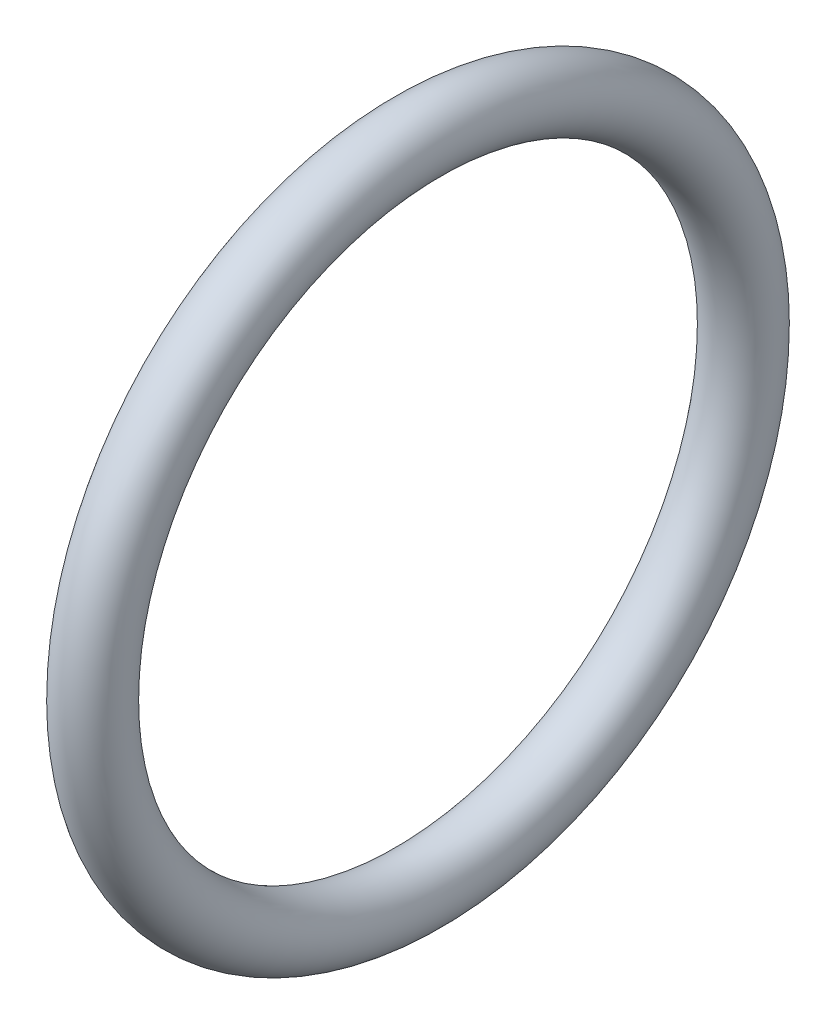
ISO-10303-21;
HEADER;
FILE_DESCRIPTION(('STEP AP214'),'2;1');
FILE_NAME('part.step','',(''),(''),'','','');
FILE_SCHEMA(('AUTOMOTIVE_DESIGN { 1 0 10303 214 1 1 1 1 }'));
ENDSEC;
DATA;
#1=APPLICATION_CONTEXT('core data for automotive mechanical design processes');
#2=APPLICATION_PROTOCOL_DEFINITION('international standard','automotive_design',2000,#1);
#3=PRODUCT_CONTEXT('',#1,'mechanical');
#4=PRODUCT('Part','Part','',(#3));
#5=PRODUCT_RELATED_PRODUCT_CATEGORY('part','',(#4));
#6=PRODUCT_DEFINITION_FORMATION('','',#4);
#7=PRODUCT_DEFINITION_CONTEXT('part definition',#1,'design');
#8=PRODUCT_DEFINITION('design','',#6,#7);
#9=PRODUCT_DEFINITION_SHAPE('','',#8);
#10=(LENGTH_UNIT() NAMED_UNIT(*) SI_UNIT(.MILLI.,.METRE.));
#11=(NAMED_UNIT(*) PLANE_ANGLE_UNIT() SI_UNIT($,.RADIAN.));
#12=(NAMED_UNIT(*) SI_UNIT($,.STERADIAN.) SOLID_ANGLE_UNIT());
#13=UNCERTAINTY_MEASURE_WITH_UNIT(LENGTH_MEASURE(1.E-05),#10,'distance_accuracy_value','');
#14=(GEOMETRIC_REPRESENTATION_CONTEXT(3) GLOBAL_UNCERTAINTY_ASSIGNED_CONTEXT((#13)) GLOBAL_UNIT_ASSIGNED_CONTEXT((#10,
#11,#12)) REPRESENTATION_CONTEXT('',''));
#15=CARTESIAN_POINT('',(0.,0.,0.));
#16=DIRECTION('',(0.,0.,1.));
#17=DIRECTION('',(1.,0.,0.));
#18=AXIS2_PLACEMENT_3D('',#15,#16,#17);
#19=CARTESIAN_POINT('',(0.,0.,0.));
#20=DIRECTION('',(-1.,0.,0.));
#21=DIRECTION('',(0.,0.,1.));
#22=AXIS2_PLACEMENT_3D('',#19,#20,#21);
#23=TOROIDAL_SURFACE('',#22,12.,1.2);
#24=CARTESIAN_POINT('',(0.,0.,13.2));
#25=VERTEX_POINT('',#24);
#26=VERTEX_LOOP('',#25);
#27=FACE_BOUND('',#26,.T.);
#28=ADVANCED_FACE('F26',(#27),#23,.T.);
#29=CLOSED_SHELL('',(#28));
#30=MANIFOLD_SOLID_BREP('B2',#29);
#31=ADVANCED_BREP_SHAPE_REPRESENTATION('',(#18,#30),#14);
#32=SHAPE_DEFINITION_REPRESENTATION(#9,#31);
ENDSEC;
END-ISO-10303-21;
